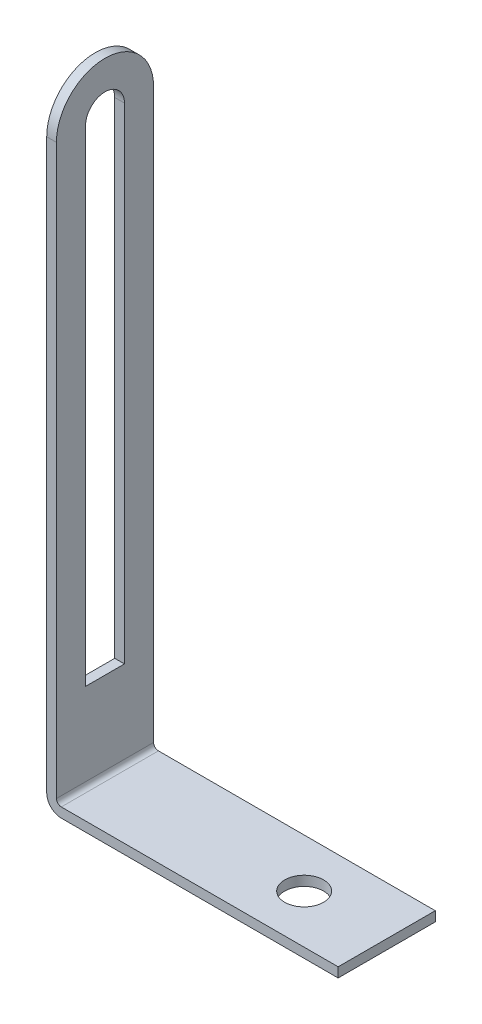
ISO-10303-21;
HEADER;
FILE_DESCRIPTION(('STEP AP214'),'2;1');
FILE_NAME('part.step','',(''),(''),'','','');
FILE_SCHEMA(('AUTOMOTIVE_DESIGN { 1 0 10303 214 1 1 1 1 }'));
ENDSEC;
DATA;
#1=APPLICATION_CONTEXT('core data for automotive mechanical design processes');
#2=APPLICATION_PROTOCOL_DEFINITION('international standard','automotive_design',2000,#1);
#3=PRODUCT_CONTEXT('',#1,'mechanical');
#4=PRODUCT('Part','Part','',(#3));
#5=PRODUCT_RELATED_PRODUCT_CATEGORY('part','',(#4));
#6=PRODUCT_DEFINITION_FORMATION('','',#4);
#7=PRODUCT_DEFINITION_CONTEXT('part definition',#1,'design');
#8=PRODUCT_DEFINITION('design','',#6,#7);
#9=PRODUCT_DEFINITION_SHAPE('','',#8);
#10=(LENGTH_UNIT() NAMED_UNIT(*) SI_UNIT(.MILLI.,.METRE.));
#11=(NAMED_UNIT(*) PLANE_ANGLE_UNIT() SI_UNIT($,.RADIAN.));
#12=(NAMED_UNIT(*) SI_UNIT($,.STERADIAN.) SOLID_ANGLE_UNIT());
#13=UNCERTAINTY_MEASURE_WITH_UNIT(LENGTH_MEASURE(1.E-05),#10,'distance_accuracy_value','');
#14=(GEOMETRIC_REPRESENTATION_CONTEXT(3) GLOBAL_UNCERTAINTY_ASSIGNED_CONTEXT((#13)) GLOBAL_UNIT_ASSIGNED_CONTEXT((#10,
#11,#12)) REPRESENTATION_CONTEXT('',''));
#15=CARTESIAN_POINT('',(0.,0.,0.));
#16=DIRECTION('',(0.,0.,1.));
#17=DIRECTION('',(1.,0.,0.));
#18=AXIS2_PLACEMENT_3D('',#15,#16,#17);
#19=CARTESIAN_POINT('',(1.,25.,0.));
#20=DIRECTION('',(-1.,0.,0.));
#21=DIRECTION('',(0.,0.,1.));
#22=AXIS2_PLACEMENT_3D('',#19,#20,#21);
#23=PLANE('',#22);
#24=DIRECTION('',(0.,1.,0.));
#25=VECTOR('',#24,1.);
#26=CARTESIAN_POINT('',(1.,-33.5,-5.00000000000002));
#27=LINE('',#26,#25);
#28=CARTESIAN_POINT('',(1.,-33.5,-5.00000000000002));
#29=VERTEX_POINT('',#28);
#30=CARTESIAN_POINT('',(1.,25.,-5.));
#31=VERTEX_POINT('',#30);
#32=EDGE_CURVE('E199',#29,#31,#27,.T.);
#33=ORIENTED_EDGE('',*,*,#32,.T.);
#34=CARTESIAN_POINT('',(1.,25.,0.));
#35=DIRECTION('',(1.,0.,0.));
#36=DIRECTION('',(0.,0.,1.));
#37=AXIS2_PLACEMENT_3D('',#34,#35,#36);
#38=CIRCLE('',#37,5.);
#39=CARTESIAN_POINT('',(1.,25.,5.));
#40=VERTEX_POINT('',#39);
#41=EDGE_CURVE('E201',#31,#40,#38,.T.);
#42=ORIENTED_EDGE('',*,*,#41,.T.);
#43=DIRECTION('',(0.,-1.,0.));
#44=VECTOR('',#43,1.);
#45=CARTESIAN_POINT('',(1.,25.,5.));
#46=LINE('',#45,#44);
#47=CARTESIAN_POINT('',(1.,-33.5,5.00000000000002));
#48=VERTEX_POINT('',#47);
#49=EDGE_CURVE('E204',#40,#48,#46,.T.);
#50=ORIENTED_EDGE('',*,*,#49,.T.);
#51=DIRECTION('',(0.,0.,-1.));
#52=VECTOR('',#51,1.);
#53=CARTESIAN_POINT('',(1.,-33.5,5.00000000000002));
#54=LINE('',#53,#52);
#55=EDGE_CURVE('E206',#48,#29,#54,.T.);
#56=ORIENTED_EDGE('',*,*,#55,.T.);
#57=EDGE_LOOP('',(#33,#42,#50,#56));
#58=FACE_BOUND('',#57,.T.);
#59=DIRECTION('',(0.,1.,0.));
#60=VECTOR('',#59,1.);
#61=CARTESIAN_POINT('',(1.,25.,-2.));
#62=LINE('',#61,#60);
#63=CARTESIAN_POINT('',(1.,-25.,-2.00000000000001));
#64=VERTEX_POINT('',#63);
#65=CARTESIAN_POINT('',(1.,25.,-2.));
#66=VERTEX_POINT('',#65);
#67=EDGE_CURVE('E173',#64,#66,#62,.T.);
#68=ORIENTED_EDGE('',*,*,#67,.F.);
#69=DIRECTION('',(0.,0.,-1.));
#70=VECTOR('',#69,1.);
#71=CARTESIAN_POINT('',(1.,-25.,2.));
#72=LINE('',#71,#70);
#73=CARTESIAN_POINT('',(1.,-25.,2.));
#74=VERTEX_POINT('',#73);
#75=EDGE_CURVE('E180',#74,#64,#72,.T.);
#76=ORIENTED_EDGE('',*,*,#75,.F.);
#77=DIRECTION('',(0.,-1.,0.));
#78=VECTOR('',#77,1.);
#79=CARTESIAN_POINT('',(1.,25.,2.));
#80=LINE('',#79,#78);
#81=CARTESIAN_POINT('',(1.,25.,2.));
#82=VERTEX_POINT('',#81);
#83=EDGE_CURVE('E178',#82,#74,#80,.T.);
#84=ORIENTED_EDGE('',*,*,#83,.F.);
#85=CARTESIAN_POINT('',(1.,25.,0.));
#86=DIRECTION('',(1.,0.,0.));
#87=DIRECTION('',(0.,0.,1.));
#88=AXIS2_PLACEMENT_3D('',#85,#86,#87);
#89=CIRCLE('',#88,2.);
#90=EDGE_CURVE('E175',#66,#82,#89,.T.);
#91=ORIENTED_EDGE('',*,*,#90,.F.);
#92=EDGE_LOOP('',(#68,#76,#84,#91));
#93=FACE_BOUND('',#92,.T.);
#94=ADVANCED_FACE('F33',(#58,#93),#23,.F.);
#95=CARTESIAN_POINT('',(0.,25.,0.));
#96=DIRECTION('',(-1.,0.,0.));
#97=DIRECTION('',(0.,0.,1.));
#98=AXIS2_PLACEMENT_3D('',#95,#96,#97);
#99=PLANE('',#98);
#100=DIRECTION('',(0.,1.,0.));
#101=VECTOR('',#100,1.);
#102=CARTESIAN_POINT('',(0.,25.,-5.));
#103=LINE('',#102,#101);
#104=CARTESIAN_POINT('',(0.,-33.5,-5.00000000000002));
#105=VERTEX_POINT('',#104);
#106=CARTESIAN_POINT('',(0.,25.,-5.));
#107=VERTEX_POINT('',#106);
#108=EDGE_CURVE('E198',#105,#107,#103,.T.);
#109=ORIENTED_EDGE('',*,*,#108,.F.);
#110=DIRECTION('',(0.,0.,-1.));
#111=VECTOR('',#110,1.);
#112=CARTESIAN_POINT('',(0.,-33.5,5.00000000000002));
#113=LINE('',#112,#111);
#114=CARTESIAN_POINT('',(0.,-33.5,4.99999999999998));
#115=VERTEX_POINT('',#114);
#116=EDGE_CURVE('E202',#115,#105,#113,.T.);
#117=ORIENTED_EDGE('',*,*,#116,.F.);
#118=DIRECTION('',(0.,-1.,0.));
#119=VECTOR('',#118,1.);
#120=CARTESIAN_POINT('',(0.,-25.,5.00000000000001));
#121=LINE('',#120,#119);
#122=CARTESIAN_POINT('',(0.,25.,5.));
#123=VERTEX_POINT('',#122);
#124=EDGE_CURVE('E150',#123,#115,#121,.T.);
#125=ORIENTED_EDGE('',*,*,#124,.F.);
#126=CARTESIAN_POINT('',(0.,25.,0.));
#127=DIRECTION('',(1.,0.,0.));
#128=DIRECTION('',(0.,0.,1.));
#129=AXIS2_PLACEMENT_3D('',#126,#127,#128);
#130=CIRCLE('',#129,5.);
#131=EDGE_CURVE('E209',#107,#123,#130,.T.);
#132=ORIENTED_EDGE('',*,*,#131,.F.);
#133=EDGE_LOOP('',(#109,#117,#125,#132));
#134=FACE_BOUND('',#133,.T.);
#135=DIRECTION('',(0.,0.,-1.));
#136=VECTOR('',#135,1.);
#137=CARTESIAN_POINT('',(0.,-25.,2.));
#138=LINE('',#137,#136);
#139=CARTESIAN_POINT('',(0.,-25.,2.));
#140=VERTEX_POINT('',#139);
#141=CARTESIAN_POINT('',(0.,-25.,-2.00000000000001));
#142=VERTEX_POINT('',#141);
#143=EDGE_CURVE('E176',#140,#142,#138,.T.);
#144=ORIENTED_EDGE('',*,*,#143,.T.);
#145=DIRECTION('',(0.,1.,0.));
#146=VECTOR('',#145,1.);
#147=CARTESIAN_POINT('',(0.,25.,-2.));
#148=LINE('',#147,#146);
#149=CARTESIAN_POINT('',(0.,25.,-2.));
#150=VERTEX_POINT('',#149);
#151=EDGE_CURVE('E56',#142,#150,#148,.T.);
#152=ORIENTED_EDGE('',*,*,#151,.T.);
#153=CARTESIAN_POINT('',(0.,25.,0.));
#154=DIRECTION('',(1.,0.,0.));
#155=DIRECTION('',(0.,0.,1.));
#156=AXIS2_PLACEMENT_3D('',#153,#154,#155);
#157=CIRCLE('',#156,2.);
#158=CARTESIAN_POINT('',(0.,25.,2.));
#159=VERTEX_POINT('',#158);
#160=EDGE_CURVE('E184',#150,#159,#157,.T.);
#161=ORIENTED_EDGE('',*,*,#160,.T.);
#162=DIRECTION('',(0.,-1.,0.));
#163=VECTOR('',#162,1.);
#164=CARTESIAN_POINT('',(0.,25.,2.));
#165=LINE('',#164,#163);
#166=EDGE_CURVE('E187',#159,#140,#165,.T.);
#167=ORIENTED_EDGE('',*,*,#166,.T.);
#168=EDGE_LOOP('',(#144,#152,#161,#167));
#169=FACE_BOUND('',#168,.T.);
#170=ADVANCED_FACE('F221',(#134,#169),#99,.T.);
#171=CARTESIAN_POINT('',(1.,25.,-5.));
#172=DIRECTION('',(0.,0.,1.));
#173=DIRECTION('',(0.,-1.,0.));
#174=AXIS2_PLACEMENT_3D('',#171,#172,#173);
#175=PLANE('',#174);
#176=ORIENTED_EDGE('',*,*,#108,.T.);
#177=DIRECTION('',(-1.,0.,0.));
#178=VECTOR('',#177,1.);
#179=CARTESIAN_POINT('',(1.,25.,-5.));
#180=LINE('',#179,#178);
#181=EDGE_CURVE('E11',#31,#107,#180,.T.);
#182=ORIENTED_EDGE('',*,*,#181,.F.);
#183=ORIENTED_EDGE('',*,*,#32,.F.);
#184=CARTESIAN_POINT('',(1.5,-33.5,-5.00000000000001));
#185=DIRECTION('',(0.,0.,1.));
#186=DIRECTION('',(0.,-1.,0.));
#187=AXIS2_PLACEMENT_3D('',#184,#185,#186);
#188=CIRCLE('',#187,0.500000000000001);
#189=CARTESIAN_POINT('',(1.5,-34.,-5.00000000000001));
#190=VERTEX_POINT('',#189);
#191=EDGE_CURVE('E224',#29,#190,#188,.T.);
#192=ORIENTED_EDGE('',*,*,#191,.T.);
#193=DIRECTION('',(1.,0.,0.));
#194=VECTOR('',#193,1.);
#195=CARTESIAN_POINT('',(1.5,-34.,-5.00000000000001));
#196=LINE('',#195,#194);
#197=CARTESIAN_POINT('',(30.,-34.,-5.00000000000001));
#198=VERTEX_POINT('',#197);
#199=EDGE_CURVE('E225',#190,#198,#196,.T.);
#200=ORIENTED_EDGE('',*,*,#199,.T.);
#201=DIRECTION('',(0.,-1.,0.));
#202=VECTOR('',#201,1.);
#203=CARTESIAN_POINT('',(30.,-34.,-5.00000000000001));
#204=LINE('',#203,#202);
#205=CARTESIAN_POINT('',(30.,-35.,-5.00000000000001));
#206=VERTEX_POINT('',#205);
#207=EDGE_CURVE('E167',#198,#206,#204,.T.);
#208=ORIENTED_EDGE('',*,*,#207,.T.);
#209=DIRECTION('',(-1.,0.,0.));
#210=VECTOR('',#209,1.);
#211=CARTESIAN_POINT('',(1.5,-35.,-5.00000000000001));
#212=LINE('',#211,#210);
#213=CARTESIAN_POINT('',(1.5,-35.,-5.00000000000001));
#214=VERTEX_POINT('',#213);
#215=EDGE_CURVE('E171',#206,#214,#212,.T.);
#216=ORIENTED_EDGE('',*,*,#215,.T.);
#217=CARTESIAN_POINT('',(1.5,-33.5,-5.00000000000001));
#218=DIRECTION('',(0.,0.,1.));
#219=DIRECTION('',(0.,-1.,0.));
#220=AXIS2_PLACEMENT_3D('',#217,#218,#219);
#221=CIRCLE('',#220,1.5);
#222=EDGE_CURVE('E132',#214,#105,#221,.F.);
#223=ORIENTED_EDGE('',*,*,#222,.T.);
#224=EDGE_LOOP('',(#176,#182,#183,#192,#200,#208,#216,#223));
#225=FACE_BOUND('',#224,.T.);
#226=ADVANCED_FACE('F35',(#225),#175,.F.);
#227=CARTESIAN_POINT('',(1.,25.,0.));
#228=DIRECTION('',(-1.,0.,0.));
#229=DIRECTION('',(0.,0.,1.));
#230=AXIS2_PLACEMENT_3D('',#227,#228,#229);
#231=CYLINDRICAL_SURFACE('',#230,5.);
#232=ORIENTED_EDGE('',*,*,#131,.T.);
#233=DIRECTION('',(-1.,0.,0.));
#234=VECTOR('',#233,1.);
#235=CARTESIAN_POINT('',(1.,25.,5.));
#236=LINE('',#235,#234);
#237=EDGE_CURVE('E41',#40,#123,#236,.T.);
#238=ORIENTED_EDGE('',*,*,#237,.F.);
#239=ORIENTED_EDGE('',*,*,#41,.F.);
#240=ORIENTED_EDGE('',*,*,#181,.T.);
#241=EDGE_LOOP('',(#232,#238,#239,#240));
#242=FACE_BOUND('',#241,.T.);
#243=ADVANCED_FACE('F217',(#242),#231,.T.);
#244=CARTESIAN_POINT('',(1.,-25.,5.00000000000001));
#245=DIRECTION('',(0.,0.,-1.));
#246=DIRECTION('',(0.,1.,0.));
#247=AXIS2_PLACEMENT_3D('',#244,#245,#246);
#248=PLANE('',#247);
#249=ORIENTED_EDGE('',*,*,#124,.T.);
#250=CARTESIAN_POINT('',(1.5,-33.5,4.99999999999998));
#251=DIRECTION('',(0.,0.,1.));
#252=DIRECTION('',(1.,0.,0.));
#253=AXIS2_PLACEMENT_3D('',#250,#251,#252);
#254=CIRCLE('',#253,1.5);
#255=CARTESIAN_POINT('',(1.5,-35.,4.99999999999998));
#256=VERTEX_POINT('',#255);
#257=EDGE_CURVE('E130',#115,#256,#254,.T.);
#258=ORIENTED_EDGE('',*,*,#257,.T.);
#259=DIRECTION('',(1.,0.,0.));
#260=VECTOR('',#259,1.);
#261=CARTESIAN_POINT('',(1.5,-35.,4.99999999999998));
#262=LINE('',#261,#260);
#263=CARTESIAN_POINT('',(30.,-35.,4.99999999999998));
#264=VERTEX_POINT('',#263);
#265=EDGE_CURVE('E139',#256,#264,#262,.T.);
#266=ORIENTED_EDGE('',*,*,#265,.T.);
#267=DIRECTION('',(0.,1.,0.));
#268=VECTOR('',#267,1.);
#269=CARTESIAN_POINT('',(30.,-34.,4.99999999999998));
#270=LINE('',#269,#268);
#271=CARTESIAN_POINT('',(30.,-34.,4.99999999999998));
#272=VERTEX_POINT('',#271);
#273=EDGE_CURVE('E145',#264,#272,#270,.T.);
#274=ORIENTED_EDGE('',*,*,#273,.T.);
#275=DIRECTION('',(-1.,0.,0.));
#276=VECTOR('',#275,1.);
#277=CARTESIAN_POINT('',(1.5,-34.,4.99999999999998));
#278=LINE('',#277,#276);
#279=CARTESIAN_POINT('',(1.5,-34.,4.99999999999998));
#280=VERTEX_POINT('',#279);
#281=EDGE_CURVE('E160',#272,#280,#278,.T.);
#282=ORIENTED_EDGE('',*,*,#281,.T.);
#283=CARTESIAN_POINT('',(1.5,-33.5,4.99999999999998));
#284=DIRECTION('',(0.,0.,-1.));
#285=DIRECTION('',(1.,0.,0.));
#286=AXIS2_PLACEMENT_3D('',#283,#284,#285);
#287=CIRCLE('',#286,0.500000000000001);
#288=EDGE_CURVE('E136',#280,#48,#287,.T.);
#289=ORIENTED_EDGE('',*,*,#288,.T.);
#290=ORIENTED_EDGE('',*,*,#49,.F.);
#291=ORIENTED_EDGE('',*,*,#237,.T.);
#292=EDGE_LOOP('',(#249,#258,#266,#274,#282,#289,#290,#291));
#293=FACE_BOUND('',#292,.T.);
#294=ADVANCED_FACE('F148',(#293),#248,.F.);
#295=CARTESIAN_POINT('',(1.,25.,-2.));
#296=DIRECTION('',(0.,0.,1.));
#297=DIRECTION('',(0.,-1.,0.));
#298=AXIS2_PLACEMENT_3D('',#295,#296,#297);
#299=PLANE('',#298);
#300=ORIENTED_EDGE('',*,*,#151,.F.);
#301=DIRECTION('',(-1.,0.,0.));
#302=VECTOR('',#301,1.);
#303=CARTESIAN_POINT('',(1.,-25.,-2.00000000000001));
#304=LINE('',#303,#302);
#305=EDGE_CURVE('E182',#64,#142,#304,.T.);
#306=ORIENTED_EDGE('',*,*,#305,.F.);
#307=ORIENTED_EDGE('',*,*,#67,.T.);
#308=DIRECTION('',(-1.,0.,0.));
#309=VECTOR('',#308,1.);
#310=CARTESIAN_POINT('',(1.,25.,-2.));
#311=LINE('',#310,#309);
#312=EDGE_CURVE('E196',#66,#150,#311,.T.);
#313=ORIENTED_EDGE('',*,*,#312,.T.);
#314=EDGE_LOOP('',(#300,#306,#307,#313));
#315=FACE_BOUND('',#314,.T.);
#316=ADVANCED_FACE('F259',(#315),#299,.T.);
#317=CARTESIAN_POINT('',(1.,25.,0.));
#318=DIRECTION('',(-1.,0.,0.));
#319=DIRECTION('',(0.,0.,1.));
#320=AXIS2_PLACEMENT_3D('',#317,#318,#319);
#321=CYLINDRICAL_SURFACE('',#320,2.);
#322=ORIENTED_EDGE('',*,*,#160,.F.);
#323=ORIENTED_EDGE('',*,*,#312,.F.);
#324=ORIENTED_EDGE('',*,*,#90,.T.);
#325=DIRECTION('',(-1.,0.,0.));
#326=VECTOR('',#325,1.);
#327=CARTESIAN_POINT('',(1.,25.,2.));
#328=LINE('',#327,#326);
#329=EDGE_CURVE('E194',#82,#159,#328,.T.);
#330=ORIENTED_EDGE('',*,*,#329,.T.);
#331=EDGE_LOOP('',(#322,#323,#324,#330));
#332=FACE_BOUND('',#331,.T.);
#333=ADVANCED_FACE('F299',(#332),#321,.F.);
#334=CARTESIAN_POINT('',(1.,25.,2.));
#335=DIRECTION('',(0.,0.,-1.));
#336=DIRECTION('',(0.,1.,0.));
#337=AXIS2_PLACEMENT_3D('',#334,#335,#336);
#338=PLANE('',#337);
#339=ORIENTED_EDGE('',*,*,#166,.F.);
#340=ORIENTED_EDGE('',*,*,#329,.F.);
#341=ORIENTED_EDGE('',*,*,#83,.T.);
#342=DIRECTION('',(-1.,0.,0.));
#343=VECTOR('',#342,1.);
#344=CARTESIAN_POINT('',(1.,-25.,2.));
#345=LINE('',#344,#343);
#346=EDGE_CURVE('E48',#74,#140,#345,.T.);
#347=ORIENTED_EDGE('',*,*,#346,.T.);
#348=EDGE_LOOP('',(#339,#340,#341,#347));
#349=FACE_BOUND('',#348,.T.);
#350=ADVANCED_FACE('F289',(#349),#338,.T.);
#351=CARTESIAN_POINT('',(1.,-25.,2.));
#352=DIRECTION('',(0.,1.,0.));
#353=DIRECTION('',(0.,0.,1.));
#354=AXIS2_PLACEMENT_3D('',#351,#352,#353);
#355=PLANE('',#354);
#356=ORIENTED_EDGE('',*,*,#143,.F.);
#357=ORIENTED_EDGE('',*,*,#346,.F.);
#358=ORIENTED_EDGE('',*,*,#75,.T.);
#359=ORIENTED_EDGE('',*,*,#305,.T.);
#360=EDGE_LOOP('',(#356,#357,#358,#359));
#361=FACE_BOUND('',#360,.T.);
#362=ADVANCED_FACE('F284',(#361),#355,.T.);
#363=CARTESIAN_POINT('',(1.5,-33.5,-35.0374765917512));
#364=DIRECTION('',(0.,0.,1.));
#365=DIRECTION('',(1.,0.,0.));
#366=AXIS2_PLACEMENT_3D('',#363,#364,#365);
#367=CYLINDRICAL_SURFACE('',#366,1.5);
#368=ORIENTED_EDGE('',*,*,#222,.F.);
#369=DIRECTION('',(0.,0.,1.));
#370=VECTOR('',#369,1.);
#371=CARTESIAN_POINT('',(1.5,-35.,-35.0374765917512));
#372=LINE('',#371,#370);
#373=EDGE_CURVE('E125',#214,#256,#372,.T.);
#374=ORIENTED_EDGE('',*,*,#373,.T.);
#375=ORIENTED_EDGE('',*,*,#257,.F.);
#376=ORIENTED_EDGE('',*,*,#116,.T.);
#377=EDGE_LOOP('',(#368,#374,#375,#376));
#378=FACE_BOUND('',#377,.T.);
#379=ADVANCED_FACE('F127',(#378),#367,.T.);
#380=CARTESIAN_POINT('',(1.5,-33.5,-35.0374765917512));
#381=DIRECTION('',(0.,0.,1.));
#382=DIRECTION('',(1.,0.,0.));
#383=AXIS2_PLACEMENT_3D('',#380,#381,#382);
#384=CYLINDRICAL_SURFACE('',#383,0.500000000000001);
#385=ORIENTED_EDGE('',*,*,#191,.F.);
#386=ORIENTED_EDGE('',*,*,#55,.F.);
#387=ORIENTED_EDGE('',*,*,#288,.F.);
#388=DIRECTION('',(0.,0.,1.));
#389=VECTOR('',#388,1.);
#390=CARTESIAN_POINT('',(1.5,-34.,-35.0374765917512));
#391=LINE('',#390,#389);
#392=EDGE_CURVE('E165',#190,#280,#391,.T.);
#393=ORIENTED_EDGE('',*,*,#392,.F.);
#394=EDGE_LOOP('',(#385,#386,#387,#393));
#395=FACE_BOUND('',#394,.T.);
#396=ADVANCED_FACE('F343',(#395),#384,.F.);
#397=CARTESIAN_POINT('',(1.5,-34.,-35.0374765917512));
#398=DIRECTION('',(0.,1.,0.));
#399=DIRECTION('',(0.,0.,1.));
#400=AXIS2_PLACEMENT_3D('',#397,#398,#399);
#401=PLANE('',#400);
#402=CARTESIAN_POINT('',(21.5,-34.,0.));
#403=DIRECTION('',(0.,1.,0.));
#404=DIRECTION('',(0.,0.,1.));
#405=AXIS2_PLACEMENT_3D('',#402,#403,#404);
#406=CIRCLE('',#405,2.);
#407=CARTESIAN_POINT('',(21.5,-34.,2.));
#408=VERTEX_POINT('',#407);
#409=EDGE_CURVE('E151',#408,#408,#406,.T.);
#410=ORIENTED_EDGE('',*,*,#409,.F.);
#411=EDGE_LOOP('',(#410));
#412=FACE_BOUND('',#411,.T.);
#413=ORIENTED_EDGE('',*,*,#199,.F.);
#414=ORIENTED_EDGE('',*,*,#392,.T.);
#415=ORIENTED_EDGE('',*,*,#281,.F.);
#416=DIRECTION('',(0.,0.,1.));
#417=VECTOR('',#416,1.);
#418=CARTESIAN_POINT('',(30.,-34.,-35.0374765917512));
#419=LINE('',#418,#417);
#420=EDGE_CURVE('E168',#198,#272,#419,.T.);
#421=ORIENTED_EDGE('',*,*,#420,.F.);
#422=EDGE_LOOP('',(#413,#414,#415,#421));
#423=FACE_BOUND('',#422,.T.);
#424=ADVANCED_FACE('F246',(#412,#423),#401,.T.);
#425=CARTESIAN_POINT('',(30.,-34.,-35.0374765917512));
#426=DIRECTION('',(1.,0.,0.));
#427=DIRECTION('',(0.,0.,-1.));
#428=AXIS2_PLACEMENT_3D('',#425,#426,#427);
#429=PLANE('',#428);
#430=ORIENTED_EDGE('',*,*,#207,.F.);
#431=ORIENTED_EDGE('',*,*,#420,.T.);
#432=ORIENTED_EDGE('',*,*,#273,.F.);
#433=DIRECTION('',(0.,0.,1.));
#434=VECTOR('',#433,1.);
#435=CARTESIAN_POINT('',(30.,-35.,-35.0374765917512));
#436=LINE('',#435,#434);
#437=EDGE_CURVE('E135',#206,#264,#436,.T.);
#438=ORIENTED_EDGE('',*,*,#437,.F.);
#439=EDGE_LOOP('',(#430,#431,#432,#438));
#440=FACE_BOUND('',#439,.T.);
#441=ADVANCED_FACE('F238',(#440),#429,.T.);
#442=CARTESIAN_POINT('',(1.5,-35.,-35.0374765917512));
#443=DIRECTION('',(0.,-1.,0.));
#444=DIRECTION('',(0.,0.,-1.));
#445=AXIS2_PLACEMENT_3D('',#442,#443,#444);
#446=PLANE('',#445);
#447=CARTESIAN_POINT('',(21.5,-35.,0.));
#448=DIRECTION('',(0.,-1.,0.));
#449=DIRECTION('',(0.,0.,-1.));
#450=AXIS2_PLACEMENT_3D('',#447,#448,#449);
#451=CIRCLE('',#450,2.);
#452=CARTESIAN_POINT('',(21.5,-35.,-2.));
#453=VERTEX_POINT('',#452);
#454=EDGE_CURVE('E154',#453,#453,#451,.T.);
#455=ORIENTED_EDGE('',*,*,#454,.F.);
#456=EDGE_LOOP('',(#455));
#457=FACE_BOUND('',#456,.T.);
#458=ORIENTED_EDGE('',*,*,#215,.F.);
#459=ORIENTED_EDGE('',*,*,#437,.T.);
#460=ORIENTED_EDGE('',*,*,#265,.F.);
#461=ORIENTED_EDGE('',*,*,#373,.F.);
#462=EDGE_LOOP('',(#458,#459,#460,#461));
#463=FACE_BOUND('',#462,.T.);
#464=ADVANCED_FACE('F140',(#457,#463),#446,.T.);
#465=CARTESIAN_POINT('',(21.5,30.,0.));
#466=DIRECTION('',(0.,-1.,0.));
#467=DIRECTION('',(0.,0.,-1.));
#468=AXIS2_PLACEMENT_3D('',#465,#466,#467);
#469=CYLINDRICAL_SURFACE('',#468,2.);
#470=ORIENTED_EDGE('',*,*,#409,.T.);
#471=EDGE_LOOP('',(#470));
#472=FACE_BOUND('',#471,.T.);
#473=ORIENTED_EDGE('',*,*,#454,.T.);
#474=EDGE_LOOP('',(#473));
#475=FACE_BOUND('',#474,.T.);
#476=ADVANCED_FACE('F235',(#472,#475),#469,.F.);
#477=CLOSED_SHELL('',(#94,#170,#226,#243,#294,#316,#333,#350,#362,#379,#396,#424,#441,#464,#476));
#478=MANIFOLD_SOLID_BREP('B2',#477);
#479=ADVANCED_BREP_SHAPE_REPRESENTATION('',(#18,#478),#14);
#480=SHAPE_DEFINITION_REPRESENTATION(#9,#479);
ENDSEC;
END-ISO-10303-21;
